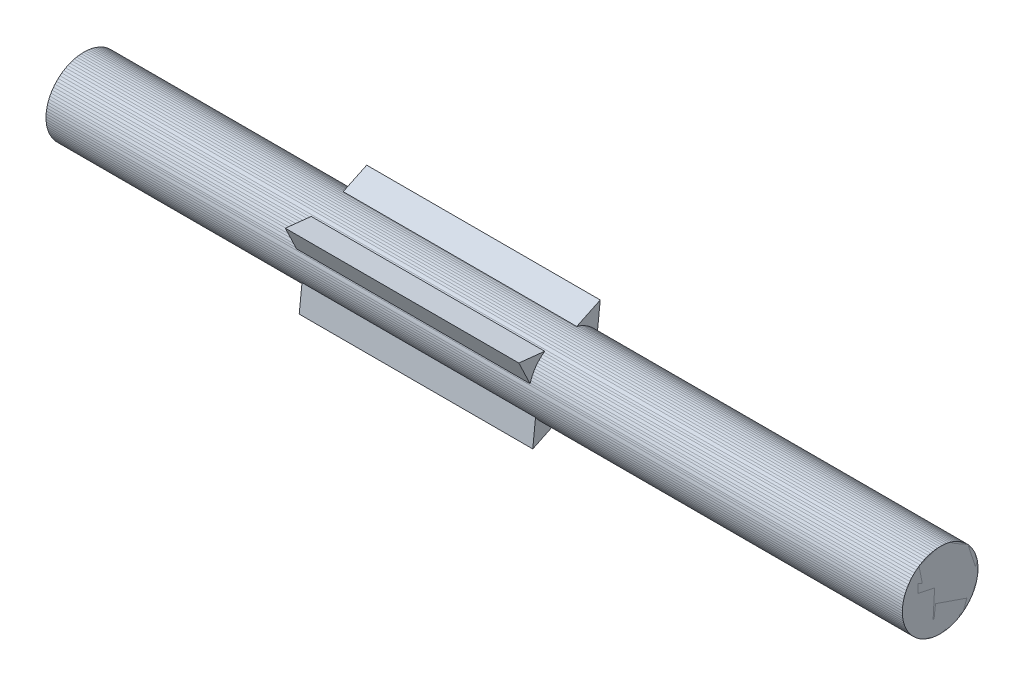
ISO-10303-21;
HEADER;
FILE_DESCRIPTION(('STEP AP214'),'2;1');
FILE_NAME('part.step','',(''),(''),'','','');
FILE_SCHEMA(('AUTOMOTIVE_DESIGN { 1 0 10303 214 1 1 1 1 }'));
ENDSEC;
DATA;
#1=APPLICATION_CONTEXT('core data for automotive mechanical design processes');
#2=APPLICATION_PROTOCOL_DEFINITION('international standard','automotive_design',2000,#1);
#3=PRODUCT_CONTEXT('',#1,'mechanical');
#4=PRODUCT('Part','Part','',(#3));
#5=PRODUCT_RELATED_PRODUCT_CATEGORY('part','',(#4));
#6=PRODUCT_DEFINITION_FORMATION('','',#4);
#7=PRODUCT_DEFINITION_CONTEXT('part definition',#1,'design');
#8=PRODUCT_DEFINITION('design','',#6,#7);
#9=PRODUCT_DEFINITION_SHAPE('','',#8);
#10=(LENGTH_UNIT() NAMED_UNIT(*) SI_UNIT(.MILLI.,.METRE.));
#11=(NAMED_UNIT(*) PLANE_ANGLE_UNIT() SI_UNIT($,.RADIAN.));
#12=(NAMED_UNIT(*) SI_UNIT($,.STERADIAN.) SOLID_ANGLE_UNIT());
#13=UNCERTAINTY_MEASURE_WITH_UNIT(LENGTH_MEASURE(1.E-05),#10,'distance_accuracy_value','');
#14=(GEOMETRIC_REPRESENTATION_CONTEXT(3) GLOBAL_UNCERTAINTY_ASSIGNED_CONTEXT((#13)) GLOBAL_UNIT_ASSIGNED_CONTEXT((#10,
#11,#12)) REPRESENTATION_CONTEXT('',''));
#15=CARTESIAN_POINT('',(0.,0.,0.));
#16=DIRECTION('',(0.,0.,1.));
#17=DIRECTION('',(1.,0.,0.));
#18=AXIS2_PLACEMENT_3D('',#15,#16,#17);
#19=CARTESIAN_POINT('',(-28.3595705872534,151.864019961174,141.573606588776));
#20=DIRECTION('',(1.,0.,0.));
#21=DIRECTION('',(0.,0.178026793479666,0.98402564031805));
#22=AXIS2_PLACEMENT_3D('',#19,#20,#21);
#23=CYLINDRICAL_SURFACE('',#22,4.8625);
#24=CARTESIAN_POINT('',(33.6404294127466,151.864019961174,141.573606588776));
#25=DIRECTION('',(1.,0.,0.));
#26=DIRECTION('',(0.,0.,-1.));
#27=AXIS2_PLACEMENT_3D('',#24,#25,#26);
#28=CIRCLE('',#27,4.8625);
#29=CARTESIAN_POINT('',(33.6404294127466,154.658716838884,137.594464016347));
#30=VERTEX_POINT('',#29);
#31=CARTESIAN_POINT('',(33.6404294127466,156.54539044226,140.258815096253));
#32=VERTEX_POINT('',#31);
#33=EDGE_CURVE('P0_E44',#30,#32,#28,.T.);
#34=ORIENTED_EDGE('',*,*,#33,.T.);
#35=DIRECTION('',(-1.,0.,0.));
#36=VECTOR('',#35,1.);
#37=CARTESIAN_POINT('',(33.6404294127466,156.54539044226,140.258815096253));
#38=LINE('',#37,#36);
#39=CARTESIAN_POINT('',(3.64042941274656,156.54539044226,140.258815096253));
#40=VERTEX_POINT('',#39);
#41=EDGE_CURVE('P0_E136',#32,#40,#38,.T.);
#42=ORIENTED_EDGE('',*,*,#41,.T.);
#43=CARTESIAN_POINT('',(3.64042941274656,151.864019961174,141.573606588776));
#44=DIRECTION('',(-1.,0.,0.));
#45=DIRECTION('',(0.,0.,1.));
#46=AXIS2_PLACEMENT_3D('',#43,#44,#45);
#47=CIRCLE('',#46,4.8625);
#48=CARTESIAN_POINT('',(3.64042941274656,154.658716838884,137.594464016347));
#49=VERTEX_POINT('',#48);
#50=EDGE_CURVE('P0_E123',#40,#49,#47,.T.);
#51=ORIENTED_EDGE('',*,*,#50,.T.);
#52=DIRECTION('',(-1.,0.,0.));
#53=VECTOR('',#52,1.);
#54=CARTESIAN_POINT('',(33.6404294127466,154.658716838884,137.594464016347));
#55=LINE('',#54,#53);
#56=EDGE_CURVE('P0_E171',#30,#49,#55,.T.);
#57=ORIENTED_EDGE('',*,*,#56,.F.);
#58=EDGE_LOOP('',(#34,#42,#51,#57));
#59=FACE_BOUND('',#58,.T.);
#60=DIRECTION('',(-1.,0.,0.));
#61=VECTOR('',#60,1.);
#62=CARTESIAN_POINT('',(33.6404294127466,149.069323083464,145.552749161205));
#63=LINE('',#62,#61);
#64=CARTESIAN_POINT('',(33.6404294127466,149.069323083464,145.552749161205));
#65=VERTEX_POINT('',#64);
#66=CARTESIAN_POINT('',(3.64042941274656,149.069323083464,145.552749161205));
#67=VERTEX_POINT('',#66);
#68=EDGE_CURVE('P0_E153',#65,#67,#63,.T.);
#69=ORIENTED_EDGE('',*,*,#68,.F.);
#70=CARTESIAN_POINT('',(33.6404294127466,147.182649480087,142.888398081299));
#71=VERTEX_POINT('',#70);
#72=EDGE_CURVE('P0_E39',#65,#71,#28,.T.);
#73=ORIENTED_EDGE('',*,*,#72,.T.);
#74=DIRECTION('',(-1.,0.,0.));
#75=VECTOR('',#74,1.);
#76=CARTESIAN_POINT('',(33.6404294127466,147.182649480087,142.888398081299));
#77=LINE('',#76,#75);
#78=CARTESIAN_POINT('',(3.64042941274656,147.182649480087,142.888398081299));
#79=VERTEX_POINT('',#78);
#80=EDGE_CURVE('P0_E159',#71,#79,#77,.T.);
#81=ORIENTED_EDGE('',*,*,#80,.T.);
#82=EDGE_CURVE('P0_E209',#79,#67,#47,.T.);
#83=ORIENTED_EDGE('',*,*,#82,.T.);
#84=EDGE_LOOP('',(#69,#73,#81,#83));
#85=FACE_BOUND('',#84,.T.);
#86=DIRECTION('',(-1.,0.,0.));
#87=VECTOR('',#86,1.);
#88=CARTESIAN_POINT('',(33.6404294127466,147.884877388745,138.778909711066));
#89=LINE('',#88,#87);
#90=CARTESIAN_POINT('',(33.6404294127466,147.884877388745,138.778909711066));
#91=VERTEX_POINT('',#90);
#92=CARTESIAN_POINT('',(3.64042941274656,147.884877388745,138.778909711066));
#93=VERTEX_POINT('',#92);
#94=EDGE_CURVE('P0_E162',#91,#93,#89,.T.);
#95=ORIENTED_EDGE('',*,*,#94,.F.);
#96=CARTESIAN_POINT('',(33.6404294127466,150.549228468651,136.892236107689));
#97=VERTEX_POINT('',#96);
#98=EDGE_CURVE('P0_E215',#91,#97,#28,.T.);
#99=ORIENTED_EDGE('',*,*,#98,.T.);
#100=DIRECTION('',(-1.,0.,0.));
#101=VECTOR('',#100,1.);
#102=CARTESIAN_POINT('',(33.6404294127466,150.549228468651,136.892236107689));
#103=LINE('',#102,#101);
#104=CARTESIAN_POINT('',(3.64042941274656,150.549228468651,136.892236107689));
#105=VERTEX_POINT('',#104);
#106=EDGE_CURVE('P0_E168',#97,#105,#103,.T.);
#107=ORIENTED_EDGE('',*,*,#106,.T.);
#108=EDGE_CURVE('P0_E132',#105,#93,#47,.T.);
#109=ORIENTED_EDGE('',*,*,#108,.T.);
#110=EDGE_LOOP('',(#95,#99,#107,#109));
#111=FACE_BOUND('',#110,.T.);
#112=CARTESIAN_POINT('',(33.6404294127466,155.843162533603,144.368303466486));
#113=VERTEX_POINT('',#112);
#114=CARTESIAN_POINT('',(33.6404294127466,153.178811453697,146.254977069862));
#115=VERTEX_POINT('',#114);
#116=EDGE_CURVE('P0_E11',#113,#115,#28,.T.);
#117=ORIENTED_EDGE('',*,*,#116,.T.);
#118=DIRECTION('',(-1.,0.,0.));
#119=VECTOR('',#118,1.);
#120=CARTESIAN_POINT('',(33.6404294127466,153.178811453697,146.254977069862));
#121=LINE('',#120,#119);
#122=CARTESIAN_POINT('',(3.64042941274656,153.178811453697,146.254977069862));
#123=VERTEX_POINT('',#122);
#124=EDGE_CURVE('P0_E150',#115,#123,#121,.T.);
#125=ORIENTED_EDGE('',*,*,#124,.T.);
#126=CARTESIAN_POINT('',(3.64042941274656,155.843162533603,144.368303466486));
#127=VERTEX_POINT('',#126);
#128=EDGE_CURVE('P0_E131',#123,#127,#47,.T.);
#129=ORIENTED_EDGE('',*,*,#128,.T.);
#130=DIRECTION('',(-1.,0.,0.));
#131=VECTOR('',#130,1.);
#132=CARTESIAN_POINT('',(33.6404294127466,155.843162533603,144.368303466486));
#133=LINE('',#132,#131);
#134=EDGE_CURVE('P0_E142',#113,#127,#133,.T.);
#135=ORIENTED_EDGE('',*,*,#134,.F.);
#136=EDGE_LOOP('',(#117,#125,#129,#135));
#137=FACE_BOUND('',#136,.T.);
#138=CARTESIAN_POINT('',(-28.3595705872534,151.864019961174,141.573606588776));
#139=DIRECTION('',(-1.,0.,0.));
#140=DIRECTION('',(0.,-0.178026793479666,-0.98402564031805));
#141=AXIS2_PLACEMENT_3D('',#138,#139,#140);
#142=CIRCLE('',#141,4.8625);
#143=CARTESIAN_POINT('',(-28.3595705872534,150.998364677879,136.788781912729));
#144=VERTEX_POINT('',#143);
#145=EDGE_CURVE('P0_E206',#144,#144,#142,.T.);
#146=ORIENTED_EDGE('',*,*,#145,.F.);
#147=EDGE_LOOP('',(#146));
#148=FACE_BOUND('',#147,.T.);
#149=CARTESIAN_POINT('',(81.6404294127465,151.864019961174,141.573606588776));
#150=DIRECTION('',(-1.,0.,0.));
#151=DIRECTION('',(0.,-0.178026793479666,-0.98402564031805));
#152=AXIS2_PLACEMENT_3D('',#149,#150,#151);
#153=CIRCLE('',#152,4.8625);
#154=CARTESIAN_POINT('',(81.6404294127465,150.998364677879,136.788781912729));
#155=VERTEX_POINT('',#154);
#156=EDGE_CURVE('P0_E190',#155,#155,#153,.T.);
#157=ORIENTED_EDGE('',*,*,#156,.T.);
#158=EDGE_LOOP('',(#157));
#159=FACE_BOUND('',#158,.T.);
#160=ADVANCED_FACE('P0_F36',(#59,#85,#111,#137,#148,#159),#23,.T.);
#161=CARTESIAN_POINT('',(-28.3595705872534,151.864019961174,141.573606588776));
#162=DIRECTION('',(-1.,0.,0.));
#163=DIRECTION('',(0.,-0.178026793479666,-0.98402564031805));
#164=AXIS2_PLACEMENT_3D('',#161,#162,#163);
#165=PLANE('',#164);
#166=ORIENTED_EDGE('',*,*,#145,.T.);
#167=EDGE_LOOP('',(#166));
#168=FACE_BOUND('',#167,.T.);
#169=ADVANCED_FACE('P0_F250',(#168),#165,.T.);
#170=CARTESIAN_POINT('',(81.6404294127465,151.864019961174,141.573606588776));
#171=DIRECTION('',(-1.,0.,0.));
#172=DIRECTION('',(0.,-0.178026793479666,-0.98402564031805));
#173=AXIS2_PLACEMENT_3D('',#170,#171,#172);
#174=PLANE('',#173);
#175=ORIENTED_EDGE('',*,*,#156,.F.);
#176=EDGE_LOOP('',(#175));
#177=FACE_BOUND('',#176,.T.);
#178=ADVANCED_FACE('P0_F254',(#177),#174,.F.);
#179=CARTESIAN_POINT('',(33.6404294127466,145.743213272465,145.907856867596));
#180=DIRECTION('',(0.,0.902674915660499,0.430323130493019));
#181=DIRECTION('',(0.,-0.430323130493019,0.902674915660499));
#182=AXIS2_PLACEMENT_3D('',#179,#180,#181);
#183=PLANE('',#182);
#184=DIRECTION('',(0.,0.430323130493019,-0.902674915660499));
#185=VECTOR('',#184,1.);
#186=CARTESIAN_POINT('',(3.64042941274656,145.743213272465,145.907856867596));
#187=LINE('',#186,#185);
#188=CARTESIAN_POINT('',(3.64042941274656,145.743213272465,145.907856867596));
#189=VERTEX_POINT('',#188);
#190=EDGE_CURVE('P0_E180',#189,#79,#187,.T.);
#191=ORIENTED_EDGE('',*,*,#190,.T.);
#192=ORIENTED_EDGE('',*,*,#80,.F.);
#193=DIRECTION('',(0.,0.430323130493019,-0.902674915660499));
#194=VECTOR('',#193,1.);
#195=CARTESIAN_POINT('',(33.6404294127466,145.743213272465,145.907856867596));
#196=LINE('',#195,#194);
#197=CARTESIAN_POINT('',(33.6404294127466,145.743213272465,145.907856867596));
#198=VERTEX_POINT('',#197);
#199=EDGE_CURVE('P0_E194',#198,#71,#196,.T.);
#200=ORIENTED_EDGE('',*,*,#199,.F.);
#201=DIRECTION('',(-1.,0.,0.));
#202=VECTOR('',#201,1.);
#203=CARTESIAN_POINT('',(33.6404294127466,145.743213272465,145.907856867596));
#204=LINE('',#203,#202);
#205=EDGE_CURVE('P0_E156',#198,#189,#204,.T.);
#206=ORIENTED_EDGE('',*,*,#205,.T.);
#207=EDGE_LOOP('',(#191,#192,#200,#206));
#208=FACE_BOUND('',#207,.T.);
#209=ADVANCED_FACE('P0_F259',(#208),#183,.F.);
#210=CARTESIAN_POINT('',(33.6404294127466,145.743213272465,145.907856867596));
#211=DIRECTION('',(0.,-0.106160355747028,-0.994349022661392));
#212=DIRECTION('',(0.,0.994349022661392,-0.106160355747028));
#213=AXIS2_PLACEMENT_3D('',#210,#211,#212);
#214=PLANE('',#213);
#215=DIRECTION('',(0.,-0.994349022661392,0.106160355747028));
#216=VECTOR('',#215,1.);
#217=CARTESIAN_POINT('',(3.64042941274656,145.743213272465,145.907856867596));
#218=LINE('',#217,#216);
#219=EDGE_CURVE('P0_E183',#67,#189,#218,.T.);
#220=ORIENTED_EDGE('',*,*,#219,.T.);
#221=ORIENTED_EDGE('',*,*,#205,.F.);
#222=DIRECTION('',(0.,-0.994349022661392,0.106160355747028));
#223=VECTOR('',#222,1.);
#224=CARTESIAN_POINT('',(33.6404294127466,145.743213272465,145.907856867596));
#225=LINE('',#224,#223);
#226=EDGE_CURVE('P0_E196',#65,#198,#225,.T.);
#227=ORIENTED_EDGE('',*,*,#226,.F.);
#228=ORIENTED_EDGE('',*,*,#68,.T.);
#229=EDGE_LOOP('',(#220,#221,#227,#228));
#230=FACE_BOUND('',#229,.T.);
#231=ADVANCED_FACE('P0_F267',(#230),#214,.F.);
#232=CARTESIAN_POINT('',(3.64042941274656,151.864019961174,141.573606588776));
#233=DIRECTION('',(-1.,0.,0.));
#234=DIRECTION('',(0.,0.577900037176034,0.816107558494552));
#235=AXIS2_PLACEMENT_3D('',#232,#233,#234);
#236=PLANE('',#235);
#237=ORIENTED_EDGE('',*,*,#82,.F.);
#238=ORIENTED_EDGE('',*,*,#190,.F.);
#239=ORIENTED_EDGE('',*,*,#219,.F.);
#240=EDGE_LOOP('',(#237,#238,#239));
#241=FACE_BOUND('',#240,.T.);
#242=ADVANCED_FACE('P0_F243',(#241),#236,.T.);
#243=CARTESIAN_POINT('',(33.6404294127466,151.864019961174,141.573606588776));
#244=DIRECTION('',(1.,0.,0.));
#245=DIRECTION('',(0.,-0.577900037176034,-0.816107558494552));
#246=AXIS2_PLACEMENT_3D('',#243,#244,#245);
#247=PLANE('',#246);
#248=ORIENTED_EDGE('',*,*,#72,.F.);
#249=ORIENTED_EDGE('',*,*,#226,.T.);
#250=ORIENTED_EDGE('',*,*,#199,.T.);
#251=EDGE_LOOP('',(#248,#249,#250));
#252=FACE_BOUND('',#251,.T.);
#253=ADVANCED_FACE('P0_F236',(#252),#247,.T.);
#254=ORIENTED_EDGE('',*,*,#98,.F.);
#255=DIRECTION('',(0.,-0.106160355747047,-0.99434902266139));
#256=VECTOR('',#255,1.);
#257=CARTESIAN_POINT('',(33.6404294127466,147.529769682354,135.452799900067));
#258=LINE('',#257,#256);
#259=CARTESIAN_POINT('',(33.6404294127466,147.529769682354,135.452799900067));
#260=VERTEX_POINT('',#259);
#261=EDGE_CURVE('P0_E192',#91,#260,#258,.T.);
#262=ORIENTED_EDGE('',*,*,#261,.T.);
#263=DIRECTION('',(0.,0.902674915660497,0.430323130493023));
#264=VECTOR('',#263,1.);
#265=CARTESIAN_POINT('',(33.6404294127466,147.529769682354,135.452799900067));
#266=LINE('',#265,#264);
#267=EDGE_CURVE('P0_E173',#260,#97,#266,.T.);
#268=ORIENTED_EDGE('',*,*,#267,.T.);
#269=EDGE_LOOP('',(#254,#262,#268));
#270=FACE_BOUND('',#269,.T.);
#271=ADVANCED_FACE('P0_F234',(#270),#247,.T.);
#272=ORIENTED_EDGE('',*,*,#108,.F.);
#273=DIRECTION('',(0.,0.902674915660497,0.430323130493023));
#274=VECTOR('',#273,1.);
#275=CARTESIAN_POINT('',(3.64042941274656,147.529769682354,135.452799900067));
#276=LINE('',#275,#274);
#277=CARTESIAN_POINT('',(3.64042941274656,147.529769682354,135.452799900067));
#278=VERTEX_POINT('',#277);
#279=EDGE_CURVE('P0_E174',#278,#105,#276,.T.);
#280=ORIENTED_EDGE('',*,*,#279,.F.);
#281=DIRECTION('',(0.,-0.106160355747047,-0.99434902266139));
#282=VECTOR('',#281,1.);
#283=CARTESIAN_POINT('',(3.64042941274656,147.529769682354,135.452799900067));
#284=LINE('',#283,#282);
#285=EDGE_CURVE('P0_E177',#93,#278,#284,.T.);
#286=ORIENTED_EDGE('',*,*,#285,.F.);
#287=EDGE_LOOP('',(#272,#280,#286));
#288=FACE_BOUND('',#287,.T.);
#289=ADVANCED_FACE('P0_F225',(#288),#236,.T.);
#290=CARTESIAN_POINT('',(33.6404294127466,147.529769682354,135.452799900067));
#291=DIRECTION('',(0.,-0.430323130493023,0.902674915660497));
#292=DIRECTION('',(0.,-0.902674915660497,-0.430323130493023));
#293=AXIS2_PLACEMENT_3D('',#290,#291,#292);
#294=PLANE('',#293);
#295=ORIENTED_EDGE('',*,*,#279,.T.);
#296=ORIENTED_EDGE('',*,*,#106,.F.);
#297=ORIENTED_EDGE('',*,*,#267,.F.);
#298=DIRECTION('',(-1.,0.,0.));
#299=VECTOR('',#298,1.);
#300=CARTESIAN_POINT('',(33.6404294127466,147.529769682354,135.452799900067));
#301=LINE('',#300,#299);
#302=EDGE_CURVE('P0_E165',#260,#278,#301,.T.);
#303=ORIENTED_EDGE('',*,*,#302,.T.);
#304=EDGE_LOOP('',(#295,#296,#297,#303));
#305=FACE_BOUND('',#304,.T.);
#306=ADVANCED_FACE('P0_F227',(#305),#294,.F.);
#307=CARTESIAN_POINT('',(33.6404294127466,147.529769682354,135.452799900067));
#308=DIRECTION('',(0.,0.99434902266139,-0.106160355747047));
#309=DIRECTION('',(0.,0.106160355747047,0.99434902266139));
#310=AXIS2_PLACEMENT_3D('',#307,#308,#309);
#311=PLANE('',#310);
#312=ORIENTED_EDGE('',*,*,#285,.T.);
#313=ORIENTED_EDGE('',*,*,#302,.F.);
#314=ORIENTED_EDGE('',*,*,#261,.F.);
#315=ORIENTED_EDGE('',*,*,#94,.T.);
#316=EDGE_LOOP('',(#312,#313,#314,#315));
#317=FACE_BOUND('',#316,.T.);
#318=ADVANCED_FACE('P0_F232',(#317),#311,.F.);
#319=ORIENTED_EDGE('',*,*,#33,.F.);
#320=DIRECTION('',(0.,0.99434902266139,-0.106160355747043));
#321=VECTOR('',#320,1.);
#322=CARTESIAN_POINT('',(33.6404294127466,157.984826649883,137.239356309956));
#323=LINE('',#322,#321);
#324=CARTESIAN_POINT('',(33.6404294127466,157.984826649883,137.239356309956));
#325=VERTEX_POINT('',#324);
#326=EDGE_CURVE('P0_E178',#30,#325,#323,.T.);
#327=ORIENTED_EDGE('',*,*,#326,.T.);
#328=DIRECTION('',(0.,-0.430323130493023,0.902674915660497));
#329=VECTOR('',#328,1.);
#330=CARTESIAN_POINT('',(33.6404294127466,157.984826649883,137.239356309956));
#331=LINE('',#330,#329);
#332=EDGE_CURVE('P0_E202',#325,#32,#331,.T.);
#333=ORIENTED_EDGE('',*,*,#332,.T.);
#334=EDGE_LOOP('',(#319,#327,#333));
#335=FACE_BOUND('',#334,.T.);
#336=ADVANCED_FACE('P0_F238',(#335),#247,.T.);
#337=ORIENTED_EDGE('',*,*,#50,.F.);
#338=DIRECTION('',(0.,-0.430323130493023,0.902674915660497));
#339=VECTOR('',#338,1.);
#340=CARTESIAN_POINT('',(3.64042941274656,157.984826649883,137.239356309956));
#341=LINE('',#340,#339);
#342=CARTESIAN_POINT('',(3.64042941274656,157.984826649883,137.239356309956));
#343=VERTEX_POINT('',#342);
#344=EDGE_CURVE('P0_E126',#343,#40,#341,.T.);
#345=ORIENTED_EDGE('',*,*,#344,.F.);
#346=DIRECTION('',(0.,0.99434902266139,-0.106160355747043));
#347=VECTOR('',#346,1.);
#348=CARTESIAN_POINT('',(3.64042941274656,157.984826649883,137.239356309956));
#349=LINE('',#348,#347);
#350=EDGE_CURVE('P0_E59',#49,#343,#349,.T.);
#351=ORIENTED_EDGE('',*,*,#350,.F.);
#352=EDGE_LOOP('',(#337,#345,#351));
#353=FACE_BOUND('',#352,.T.);
#354=ADVANCED_FACE('P0_F125',(#353),#236,.T.);
#355=CARTESIAN_POINT('',(33.6404294127466,157.984826649883,137.239356309956));
#356=DIRECTION('',(0.,0.106160355747043,0.99434902266139));
#357=DIRECTION('',(0.,-0.99434902266139,0.106160355747043));
#358=AXIS2_PLACEMENT_3D('',#355,#356,#357);
#359=PLANE('',#358);
#360=ORIENTED_EDGE('',*,*,#350,.T.);
#361=DIRECTION('',(-1.,0.,0.));
#362=VECTOR('',#361,1.);
#363=CARTESIAN_POINT('',(33.6404294127466,157.984826649883,137.239356309956));
#364=LINE('',#363,#362);
#365=EDGE_CURVE('P0_E139',#325,#343,#364,.T.);
#366=ORIENTED_EDGE('',*,*,#365,.F.);
#367=ORIENTED_EDGE('',*,*,#326,.F.);
#368=ORIENTED_EDGE('',*,*,#56,.T.);
#369=EDGE_LOOP('',(#360,#366,#367,#368));
#370=FACE_BOUND('',#369,.T.);
#371=ADVANCED_FACE('P0_F289',(#370),#359,.F.);
#372=CARTESIAN_POINT('',(33.6404294127466,157.984826649883,137.239356309956));
#373=DIRECTION('',(0.,-0.902674915660497,-0.430323130493023));
#374=DIRECTION('',(0.,0.430323130493023,-0.902674915660497));
#375=AXIS2_PLACEMENT_3D('',#372,#373,#374);
#376=PLANE('',#375);
#377=ORIENTED_EDGE('',*,*,#344,.T.);
#378=ORIENTED_EDGE('',*,*,#41,.F.);
#379=ORIENTED_EDGE('',*,*,#332,.F.);
#380=ORIENTED_EDGE('',*,*,#365,.T.);
#381=EDGE_LOOP('',(#377,#378,#379,#380));
#382=FACE_BOUND('',#381,.T.);
#383=ADVANCED_FACE('P0_F135',(#382),#376,.F.);
#384=ORIENTED_EDGE('',*,*,#116,.F.);
#385=DIRECTION('',(0.,0.106160355747071,0.994349022661387));
#386=VECTOR('',#385,1.);
#387=CARTESIAN_POINT('',(33.6404294127466,156.198270239994,147.694413277484));
#388=LINE('',#387,#386);
#389=CARTESIAN_POINT('',(33.6404294127466,156.198270239994,147.694413277484));
#390=VERTEX_POINT('',#389);
#391=EDGE_CURVE('P0_E200',#113,#390,#388,.T.);
#392=ORIENTED_EDGE('',*,*,#391,.T.);
#393=DIRECTION('',(0.,-0.902674915660501,-0.430323130493013));
#394=VECTOR('',#393,1.);
#395=CARTESIAN_POINT('',(33.6404294127466,156.198270239994,147.694413277484));
#396=LINE('',#395,#394);
#397=EDGE_CURVE('P0_E198',#390,#115,#396,.T.);
#398=ORIENTED_EDGE('',*,*,#397,.T.);
#399=EDGE_LOOP('',(#384,#392,#398));
#400=FACE_BOUND('',#399,.T.);
#401=ADVANCED_FACE('P0_F245',(#400),#247,.T.);
#402=ORIENTED_EDGE('',*,*,#128,.F.);
#403=DIRECTION('',(0.,-0.902674915660501,-0.430323130493013));
#404=VECTOR('',#403,1.);
#405=CARTESIAN_POINT('',(3.64042941274656,156.198270239994,147.694413277484));
#406=LINE('',#405,#404);
#407=CARTESIAN_POINT('',(3.64042941274656,156.198270239994,147.694413277484));
#408=VERTEX_POINT('',#407);
#409=EDGE_CURVE('P0_E185',#408,#123,#406,.T.);
#410=ORIENTED_EDGE('',*,*,#409,.F.);
#411=DIRECTION('',(0.,0.106160355747071,0.994349022661387));
#412=VECTOR('',#411,1.);
#413=CARTESIAN_POINT('',(3.64042941274656,156.198270239994,147.694413277484));
#414=LINE('',#413,#412);
#415=EDGE_CURVE('P0_E51',#127,#408,#414,.T.);
#416=ORIENTED_EDGE('',*,*,#415,.F.);
#417=EDGE_LOOP('',(#402,#410,#416));
#418=FACE_BOUND('',#417,.T.);
#419=ADVANCED_FACE('P0_F279',(#418),#236,.T.);
#420=CARTESIAN_POINT('',(33.6404294127466,156.198270239994,147.694413277484));
#421=DIRECTION('',(0.,0.430323130493013,-0.902674915660502));
#422=DIRECTION('',(0.,0.902674915660502,0.430323130493013));
#423=AXIS2_PLACEMENT_3D('',#420,#421,#422);
#424=PLANE('',#423);
#425=ORIENTED_EDGE('',*,*,#409,.T.);
#426=ORIENTED_EDGE('',*,*,#124,.F.);
#427=ORIENTED_EDGE('',*,*,#397,.F.);
#428=DIRECTION('',(-1.,0.,0.));
#429=VECTOR('',#428,1.);
#430=CARTESIAN_POINT('',(33.6404294127466,156.198270239994,147.694413277484));
#431=LINE('',#430,#429);
#432=EDGE_CURVE('P0_E144',#390,#408,#431,.T.);
#433=ORIENTED_EDGE('',*,*,#432,.T.);
#434=EDGE_LOOP('',(#425,#426,#427,#433));
#435=FACE_BOUND('',#434,.T.);
#436=ADVANCED_FACE('P0_F281',(#435),#424,.F.);
#437=CARTESIAN_POINT('',(33.6404294127466,156.198270239994,147.694413277484));
#438=DIRECTION('',(0.,-0.994349022661387,0.106160355747071));
#439=DIRECTION('',(0.,-0.106160355747071,-0.994349022661387));
#440=AXIS2_PLACEMENT_3D('',#437,#438,#439);
#441=PLANE('',#440);
#442=ORIENTED_EDGE('',*,*,#415,.T.);
#443=ORIENTED_EDGE('',*,*,#432,.F.);
#444=ORIENTED_EDGE('',*,*,#391,.F.);
#445=ORIENTED_EDGE('',*,*,#134,.T.);
#446=EDGE_LOOP('',(#442,#443,#444,#445));
#447=FACE_BOUND('',#446,.T.);
#448=ADVANCED_FACE('P0_F285',(#447),#441,.F.);
#449=CLOSED_SHELL('',(#160,#169,#178,#209,#231,#242,#253,#271,#289,#306,#318,#336,#354,#371,
#383,#401,#419,#436,#448));
#450=MANIFOLD_SOLID_BREP('P0_B2',#449);
#451=CARTESIAN_POINT('',(-28.3595705872534,151.864019961174,141.573606588776));
#452=DIRECTION('',(1.,0.,0.));
#453=DIRECTION('',(0.,0.178026793479666,0.98402564031805));
#454=AXIS2_PLACEMENT_3D('',#451,#452,#453);
#455=CYLINDRICAL_SURFACE('',#454,4.8625);
#456=CARTESIAN_POINT('',(-28.3595705872534,151.864019961174,141.573606588776));
#457=DIRECTION('',(-1.,0.,0.));
#458=DIRECTION('',(0.,-0.178026793479666,-0.98402564031805));
#459=AXIS2_PLACEMENT_3D('',#456,#457,#458);
#460=CIRCLE('',#459,4.8625);
#461=CARTESIAN_POINT('',(-28.3595705872534,152.729675244469,146.358431264822));
#462=VERTEX_POINT('',#461);
#463=EDGE_CURVE('P1_E10',#462,#462,#460,.T.);
#464=CARTESIAN_POINT('',(81.6404294127465,151.864019961174,141.573606588776));
#465=DIRECTION('',(-1.,0.,0.));
#466=DIRECTION('',(0.,-0.178026793479666,-0.98402564031805));
#467=AXIS2_PLACEMENT_3D('',#464,#465,#466);
#468=CIRCLE('',#467,4.8625);
#469=CARTESIAN_POINT('',(81.6404294127466,152.729675244469,146.358431264822));
#470=VERTEX_POINT('',#469);
#471=EDGE_CURVE('P1_E17',#470,#470,#468,.T.);
#472=CARTESIAN_POINT('',(-28.3595705872534,152.729675244469,146.358431264822));
#473=CARTESIAN_POINT('',(-27.2137372539201,152.729675244469,146.358431264822));
#474=CARTESIAN_POINT('',(-26.0679039205868,152.729675244469,146.358431264822));
#475=CARTESIAN_POINT('',(-23.7762372539201,152.729675244469,146.358431264822));
#476=CARTESIAN_POINT('',(-22.6304039205868,152.729675244469,146.358431264822));
#477=CARTESIAN_POINT('',(-20.3387372539201,152.729675244469,146.358431264822));
#478=CARTESIAN_POINT('',(-19.1929039205868,152.729675244469,146.358431264822));
#479=CARTESIAN_POINT('',(-16.9012372539201,152.729675244469,146.358431264822));
#480=CARTESIAN_POINT('',(-15.7554039205868,152.729675244469,146.358431264822));
#481=CARTESIAN_POINT('',(-13.4637372539201,152.729675244469,146.358431264822));
#482=CARTESIAN_POINT('',(-12.3179039205868,152.729675244469,146.358431264822));
#483=CARTESIAN_POINT('',(-10.0262372539201,152.729675244469,146.358431264822));
#484=CARTESIAN_POINT('',(-8.88040392058677,152.729675244469,146.358431264822));
#485=CARTESIAN_POINT('',(-6.5887372539201,152.729675244469,146.358431264822));
#486=CARTESIAN_POINT('',(-5.44290392058677,152.729675244469,146.358431264822));
#487=CARTESIAN_POINT('',(-3.1512372539201,152.729675244469,146.358431264822));
#488=CARTESIAN_POINT('',(-2.00540392058677,152.729675244469,146.358431264822));
#489=CARTESIAN_POINT('',(0.286262746079896,152.729675244469,146.358431264822));
#490=CARTESIAN_POINT('',(1.43209607941323,152.729675244469,146.358431264822));
#491=CARTESIAN_POINT('',(3.72376274607989,152.729675244469,146.358431264822));
#492=CARTESIAN_POINT('',(4.86959607941322,152.729675244469,146.358431264822));
#493=CARTESIAN_POINT('',(7.16126274607989,152.729675244469,146.358431264822));
#494=CARTESIAN_POINT('',(8.30709607941322,152.729675244469,146.358431264822));
#495=CARTESIAN_POINT('',(10.5987627460799,152.729675244469,146.358431264822));
#496=CARTESIAN_POINT('',(11.7445960794132,152.729675244469,146.358431264822));
#497=CARTESIAN_POINT('',(14.0362627460799,152.729675244469,146.358431264822));
#498=CARTESIAN_POINT('',(15.1820960794132,152.729675244469,146.358431264822));
#499=CARTESIAN_POINT('',(17.4737627460799,152.729675244469,146.358431264822));
#500=CARTESIAN_POINT('',(18.6195960794132,152.729675244469,146.358431264822));
#501=CARTESIAN_POINT('',(20.9112627460799,152.729675244469,146.358431264822));
#502=CARTESIAN_POINT('',(22.0570960794132,152.729675244469,146.358431264822));
#503=CARTESIAN_POINT('',(24.3487627460799,152.729675244469,146.358431264822));
#504=CARTESIAN_POINT('',(25.4945960794132,152.729675244469,146.358431264822));
#505=CARTESIAN_POINT('',(27.7862627460799,152.729675244469,146.358431264822));
#506=CARTESIAN_POINT('',(28.9320960794132,152.729675244469,146.358431264822));
#507=CARTESIAN_POINT('',(31.2237627460799,152.729675244469,146.358431264822));
#508=CARTESIAN_POINT('',(32.3695960794132,152.729675244469,146.358431264822));
#509=CARTESIAN_POINT('',(34.6612627460799,152.729675244469,146.358431264822));
#510=CARTESIAN_POINT('',(35.8070960794132,152.729675244469,146.358431264822));
#511=CARTESIAN_POINT('',(38.0987627460799,152.729675244469,146.358431264822));
#512=CARTESIAN_POINT('',(39.2445960794132,152.729675244469,146.358431264822));
#513=CARTESIAN_POINT('',(41.5362627460799,152.729675244469,146.358431264822));
#514=CARTESIAN_POINT('',(42.6820960794132,152.729675244469,146.358431264822));
#515=CARTESIAN_POINT('',(44.9737627460799,152.729675244469,146.358431264822));
#516=CARTESIAN_POINT('',(46.1195960794132,152.729675244469,146.358431264822));
#517=CARTESIAN_POINT('',(48.4112627460799,152.729675244469,146.358431264822));
#518=CARTESIAN_POINT('',(49.5570960794132,152.729675244469,146.358431264822));
#519=CARTESIAN_POINT('',(51.8487627460799,152.729675244469,146.358431264822));
#520=CARTESIAN_POINT('',(52.9945960794132,152.729675244469,146.358431264822));
#521=CARTESIAN_POINT('',(55.2862627460799,152.729675244469,146.358431264822));
#522=CARTESIAN_POINT('',(56.4320960794132,152.729675244469,146.358431264822));
#523=CARTESIAN_POINT('',(58.7237627460799,152.729675244469,146.358431264822));
#524=CARTESIAN_POINT('',(59.8695960794132,152.729675244469,146.358431264822));
#525=CARTESIAN_POINT('',(62.1612627460799,152.729675244469,146.358431264822));
#526=CARTESIAN_POINT('',(63.3070960794132,152.729675244469,146.358431264822));
#527=CARTESIAN_POINT('',(65.5987627460799,152.729675244469,146.358431264822));
#528=CARTESIAN_POINT('',(66.7445960794132,152.729675244469,146.358431264822));
#529=CARTESIAN_POINT('',(69.0362627460799,152.729675244469,146.358431264822));
#530=CARTESIAN_POINT('',(70.1820960794132,152.729675244469,146.358431264822));
#531=CARTESIAN_POINT('',(72.4737627460799,152.729675244469,146.358431264822));
#532=CARTESIAN_POINT('',(73.6195960794132,152.729675244469,146.358431264822));
#533=CARTESIAN_POINT('',(75.9112627460799,152.729675244469,146.358431264822));
#534=CARTESIAN_POINT('',(77.0570960794132,152.729675244469,146.358431264822));
#535=CARTESIAN_POINT('',(79.3487627460799,152.729675244469,146.358431264822));
#536=CARTESIAN_POINT('',(80.4945960794132,152.729675244469,146.358431264822));
#537=CARTESIAN_POINT('',(81.6404294127466,152.729675244469,146.358431264822));
#538=B_SPLINE_CURVE_WITH_KNOTS('',3,(#472,#473,#474,#475,#476,#477,#478,#479,#480,#481,#482,
#483,#484,#485,#486,#487,#488,#489,#490,#491,#492,#493,#494,#495,#496,#497,#498,#499,#500,#501,
#502,#503,#504,#505,#506,#507,#508,#509,#510,#511,#512,#513,#514,#515,#516,#517,#518,#519,#520,
#521,#522,#523,#524,#525,#526,#527,#528,#529,#530,#531,#532,#533,#534,#535,#536,#537),
.UNSPECIFIED.,.F.,.F.,(4,2,2,2,2,2,2,2,2,2,2,2,2,2,2,2,2,2,2,2,2,2,2,2,2,2,2,2,2,2,2,2,4),(0.,
3.4375,6.875,10.3125,13.75,17.1875,20.625,24.0625,27.5,30.9375,34.375,37.8125,41.25,44.6875,
48.125,51.5625,55.,58.4375,61.875,65.3125,68.75,72.1875,75.625,79.0625,82.5,85.9375,89.375,
92.8125,96.25,99.6875,103.125,106.5625,110.),.UNSPECIFIED.);
#539=EDGE_CURVE('P1_BSEAM14',#462,#470,#538,.T.);
#540=ORIENTED_EDGE('',*,*,#463,.F.);
#541=ORIENTED_EDGE('',*,*,#471,.T.);
#542=ORIENTED_EDGE('',*,*,#539,.T.);
#543=ORIENTED_EDGE('',*,*,#539,.F.);
#544=EDGE_LOOP('',(#540,#542,#541,#543));
#545=FACE_BOUND('',#544,.T.);
#546=ADVANCED_FACE('P1_F14',(#545),#455,.T.);
#547=CARTESIAN_POINT('',(-28.3595705872534,151.864019961174,141.573606588776));
#548=DIRECTION('',(-1.,0.,0.));
#549=DIRECTION('',(0.,-0.178026793479666,-0.98402564031805));
#550=AXIS2_PLACEMENT_3D('',#547,#548,#549);
#551=PLANE('',#550);
#552=ORIENTED_EDGE('',*,*,#463,.T.);
#553=EDGE_LOOP('',(#552));
#554=FACE_BOUND('',#553,.T.);
#555=ADVANCED_FACE('P1_F29',(#554),#551,.T.);
#556=CARTESIAN_POINT('',(81.6404294127465,151.864019961174,141.573606588776));
#557=DIRECTION('',(-1.,0.,0.));
#558=DIRECTION('',(0.,-0.178026793479666,-0.98402564031805));
#559=AXIS2_PLACEMENT_3D('',#556,#557,#558);
#560=PLANE('',#559);
#561=ORIENTED_EDGE('',*,*,#471,.F.);
#562=EDGE_LOOP('',(#561));
#563=FACE_BOUND('',#562,.T.);
#564=ADVANCED_FACE('P1_F27',(#563),#560,.F.);
#565=CLOSED_SHELL('',(#546,#555,#564));
#566=MANIFOLD_SOLID_BREP('P1_B1',#565);
#567=ADVANCED_BREP_SHAPE_REPRESENTATION('',(#18,#450,#566),#14);
#568=SHAPE_DEFINITION_REPRESENTATION(#9,#567);
ENDSEC;
END-ISO-10303-21;
